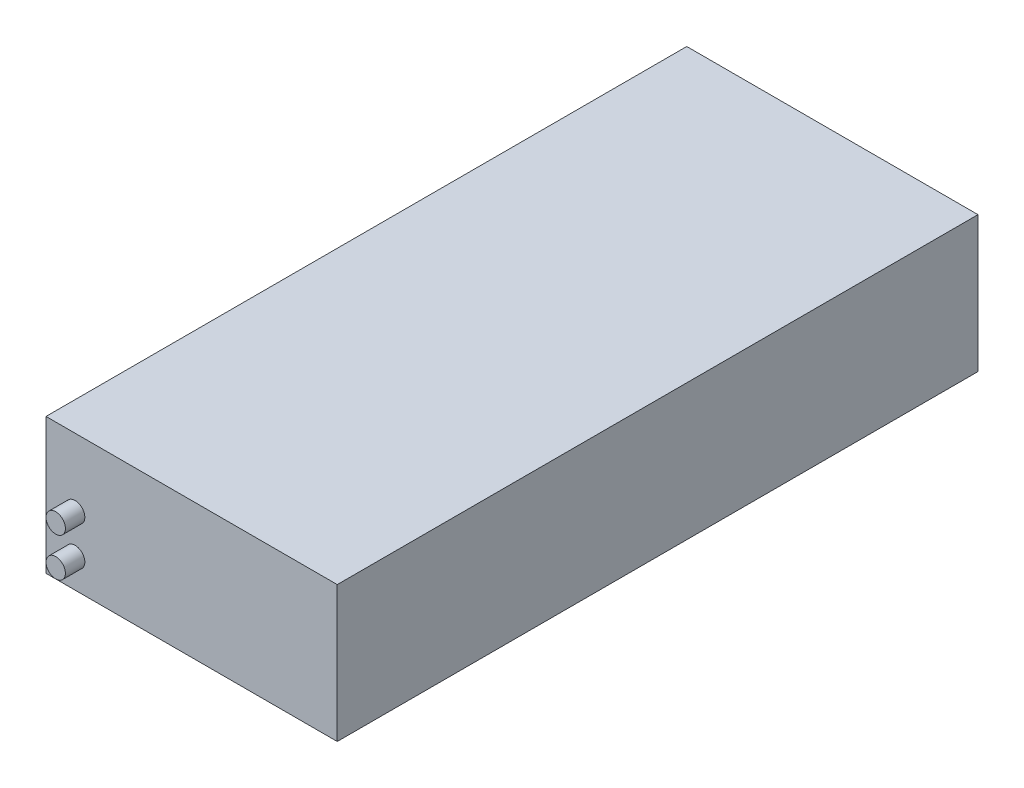
ISO-10303-21;
HEADER;
FILE_DESCRIPTION(('STEP AP214'),'2;1');
FILE_NAME('part.step','',(''),(''),'','','');
FILE_SCHEMA(('AUTOMOTIVE_DESIGN { 1 0 10303 214 1 1 1 1 }'));
ENDSEC;
DATA;
#1=APPLICATION_CONTEXT('core data for automotive mechanical design processes');
#2=APPLICATION_PROTOCOL_DEFINITION('international standard','automotive_design',2000,#1);
#3=PRODUCT_CONTEXT('',#1,'mechanical');
#4=PRODUCT('Part','Part','',(#3));
#5=PRODUCT_RELATED_PRODUCT_CATEGORY('part','',(#4));
#6=PRODUCT_DEFINITION_FORMATION('','',#4);
#7=PRODUCT_DEFINITION_CONTEXT('part definition',#1,'design');
#8=PRODUCT_DEFINITION('design','',#6,#7);
#9=PRODUCT_DEFINITION_SHAPE('','',#8);
#10=(LENGTH_UNIT() NAMED_UNIT(*) SI_UNIT(.MILLI.,.METRE.));
#11=(NAMED_UNIT(*) PLANE_ANGLE_UNIT() SI_UNIT($,.RADIAN.));
#12=(NAMED_UNIT(*) SI_UNIT($,.STERADIAN.) SOLID_ANGLE_UNIT());
#13=UNCERTAINTY_MEASURE_WITH_UNIT(LENGTH_MEASURE(1.E-05),#10,'distance_accuracy_value','');
#14=(GEOMETRIC_REPRESENTATION_CONTEXT(3) GLOBAL_UNCERTAINTY_ASSIGNED_CONTEXT((#13)) GLOBAL_UNIT_ASSIGNED_CONTEXT((#10,
#11,#12)) REPRESENTATION_CONTEXT('',''));
#15=CARTESIAN_POINT('',(0.,0.,0.));
#16=DIRECTION('',(0.,0.,1.));
#17=DIRECTION('',(1.,0.,0.));
#18=AXIS2_PLACEMENT_3D('',#15,#16,#17);
#19=CARTESIAN_POINT('',(75.,35.,330.));
#20=DIRECTION('',(-1.,0.,0.));
#21=DIRECTION('',(0.,0.,1.));
#22=AXIS2_PLACEMENT_3D('',#19,#20,#21);
#23=PLANE('',#22);
#24=DIRECTION('',(0.,1.,0.));
#25=VECTOR('',#24,1.);
#26=CARTESIAN_POINT('',(75.,35.,0.));
#27=LINE('',#26,#25);
#28=CARTESIAN_POINT('',(75.,-35.,0.));
#29=VERTEX_POINT('',#28);
#30=CARTESIAN_POINT('',(75.,35.,0.));
#31=VERTEX_POINT('',#30);
#32=EDGE_CURVE('E96',#29,#31,#27,.T.);
#33=ORIENTED_EDGE('',*,*,#32,.T.);
#34=DIRECTION('',(0.,0.,-1.));
#35=VECTOR('',#34,1.);
#36=CARTESIAN_POINT('',(75.,35.,330.));
#37=LINE('',#36,#35);
#38=CARTESIAN_POINT('',(75.,35.,330.));
#39=VERTEX_POINT('',#38);
#40=EDGE_CURVE('E11',#39,#31,#37,.T.);
#41=ORIENTED_EDGE('',*,*,#40,.F.);
#42=DIRECTION('',(0.,1.,0.));
#43=VECTOR('',#42,1.);
#44=CARTESIAN_POINT('',(75.,35.,330.));
#45=LINE('',#44,#43);
#46=CARTESIAN_POINT('',(75.,-35.,330.));
#47=VERTEX_POINT('',#46);
#48=EDGE_CURVE('E84',#47,#39,#45,.T.);
#49=ORIENTED_EDGE('',*,*,#48,.F.);
#50=DIRECTION('',(0.,0.,-1.));
#51=VECTOR('',#50,1.);
#52=CARTESIAN_POINT('',(75.,-35.,330.));
#53=LINE('',#52,#51);
#54=EDGE_CURVE('E92',#47,#29,#53,.T.);
#55=ORIENTED_EDGE('',*,*,#54,.T.);
#56=EDGE_LOOP('',(#33,#41,#49,#55));
#57=FACE_BOUND('',#56,.T.);
#58=ADVANCED_FACE('F33',(#57),#23,.F.);
#59=CARTESIAN_POINT('',(-75.,35.,330.));
#60=DIRECTION('',(0.,-1.,0.));
#61=DIRECTION('',(0.,0.,-1.));
#62=AXIS2_PLACEMENT_3D('',#59,#60,#61);
#63=PLANE('',#62);
#64=DIRECTION('',(-1.,0.,0.));
#65=VECTOR('',#64,1.);
#66=CARTESIAN_POINT('',(-75.,35.,0.));
#67=LINE('',#66,#65);
#68=CARTESIAN_POINT('',(-75.,35.,0.));
#69=VERTEX_POINT('',#68);
#70=EDGE_CURVE('E88',#31,#69,#67,.T.);
#71=ORIENTED_EDGE('',*,*,#70,.T.);
#72=DIRECTION('',(0.,0.,-1.));
#73=VECTOR('',#72,1.);
#74=CARTESIAN_POINT('',(-75.,35.,330.));
#75=LINE('',#74,#73);
#76=CARTESIAN_POINT('',(-75.,35.,330.));
#77=VERTEX_POINT('',#76);
#78=EDGE_CURVE('E41',#77,#69,#75,.T.);
#79=ORIENTED_EDGE('',*,*,#78,.F.);
#80=DIRECTION('',(-1.,0.,0.));
#81=VECTOR('',#80,1.);
#82=CARTESIAN_POINT('',(-75.,35.,330.));
#83=LINE('',#82,#81);
#84=EDGE_CURVE('E79',#39,#77,#83,.T.);
#85=ORIENTED_EDGE('',*,*,#84,.F.);
#86=ORIENTED_EDGE('',*,*,#40,.T.);
#87=EDGE_LOOP('',(#71,#79,#85,#86));
#88=FACE_BOUND('',#87,.T.);
#89=ADVANCED_FACE('F87',(#88),#63,.F.);
#90=CARTESIAN_POINT('',(-75.,35.,330.));
#91=DIRECTION('',(1.,0.,0.));
#92=DIRECTION('',(0.,0.,-1.));
#93=AXIS2_PLACEMENT_3D('',#90,#91,#92);
#94=PLANE('',#93);
#95=DIRECTION('',(0.,-1.,0.));
#96=VECTOR('',#95,1.);
#97=CARTESIAN_POINT('',(-75.,35.,0.));
#98=LINE('',#97,#96);
#99=CARTESIAN_POINT('',(-75.,-35.,0.));
#100=VERTEX_POINT('',#99);
#101=EDGE_CURVE('E66',#69,#100,#98,.T.);
#102=ORIENTED_EDGE('',*,*,#101,.T.);
#103=DIRECTION('',(0.,0.,-1.));
#104=VECTOR('',#103,1.);
#105=CARTESIAN_POINT('',(-75.,-35.,330.));
#106=LINE('',#105,#104);
#107=CARTESIAN_POINT('',(-75.,-35.,330.));
#108=VERTEX_POINT('',#107);
#109=EDGE_CURVE('E89',#108,#100,#106,.T.);
#110=ORIENTED_EDGE('',*,*,#109,.F.);
#111=DIRECTION('',(0.,-1.,0.));
#112=VECTOR('',#111,1.);
#113=CARTESIAN_POINT('',(-75.,35.,330.));
#114=LINE('',#113,#112);
#115=EDGE_CURVE('E82',#77,#108,#114,.T.);
#116=ORIENTED_EDGE('',*,*,#115,.F.);
#117=ORIENTED_EDGE('',*,*,#78,.T.);
#118=EDGE_LOOP('',(#102,#110,#116,#117));
#119=FACE_BOUND('',#118,.T.);
#120=ADVANCED_FACE('F90',(#119),#94,.F.);
#121=CARTESIAN_POINT('',(-75.,-35.,330.));
#122=DIRECTION('',(0.,1.,0.));
#123=DIRECTION('',(0.,0.,1.));
#124=AXIS2_PLACEMENT_3D('',#121,#122,#123);
#125=PLANE('',#124);
#126=DIRECTION('',(1.,0.,0.));
#127=VECTOR('',#126,1.);
#128=CARTESIAN_POINT('',(-75.,-35.,0.));
#129=LINE('',#128,#127);
#130=EDGE_CURVE('E72',#100,#29,#129,.T.);
#131=ORIENTED_EDGE('',*,*,#130,.T.);
#132=ORIENTED_EDGE('',*,*,#54,.F.);
#133=DIRECTION('',(1.,0.,0.));
#134=VECTOR('',#133,1.);
#135=CARTESIAN_POINT('',(-75.,-35.,330.));
#136=LINE('',#135,#134);
#137=EDGE_CURVE('E49',#108,#47,#136,.T.);
#138=ORIENTED_EDGE('',*,*,#137,.F.);
#139=ORIENTED_EDGE('',*,*,#109,.T.);
#140=EDGE_LOOP('',(#131,#132,#138,#139));
#141=FACE_BOUND('',#140,.T.);
#142=ADVANCED_FACE('F104',(#141),#125,.F.);
#143=CARTESIAN_POINT('',(0.,0.,330.));
#144=DIRECTION('',(0.,0.,1.));
#145=DIRECTION('',(1.,0.,0.));
#146=AXIS2_PLACEMENT_3D('',#143,#144,#145);
#147=PLANE('',#146);
#148=CARTESIAN_POINT('',(-60.,-20.,330.));
#149=DIRECTION('',(0.,0.,1.));
#150=DIRECTION('',(1.,0.,0.));
#151=AXIS2_PLACEMENT_3D('',#148,#149,#150);
#152=CIRCLE('',#151,5.);
#153=CARTESIAN_POINT('',(-55.,-20.,330.));
#154=VERTEX_POINT('',#153);
#155=EDGE_CURVE('E116',#154,#154,#152,.T.);
#156=ORIENTED_EDGE('',*,*,#155,.F.);
#157=EDGE_LOOP('',(#156));
#158=FACE_BOUND('',#157,.T.);
#159=CARTESIAN_POINT('',(-60.,0.,330.));
#160=DIRECTION('',(0.,0.,1.));
#161=DIRECTION('',(1.,0.,0.));
#162=AXIS2_PLACEMENT_3D('',#159,#160,#161);
#163=CIRCLE('',#162,5.);
#164=CARTESIAN_POINT('',(-55.,0.,330.));
#165=VERTEX_POINT('',#164);
#166=EDGE_CURVE('E110',#165,#165,#163,.T.);
#167=ORIENTED_EDGE('',*,*,#166,.F.);
#168=EDGE_LOOP('',(#167));
#169=FACE_BOUND('',#168,.T.);
#170=ORIENTED_EDGE('',*,*,#48,.T.);
#171=ORIENTED_EDGE('',*,*,#84,.T.);
#172=ORIENTED_EDGE('',*,*,#115,.T.);
#173=ORIENTED_EDGE('',*,*,#137,.T.);
#174=EDGE_LOOP('',(#170,#171,#172,#173));
#175=FACE_BOUND('',#174,.T.);
#176=ADVANCED_FACE('F80',(#158,#169,#175),#147,.T.);
#177=CARTESIAN_POINT('',(0.,0.,0.));
#178=DIRECTION('',(0.,0.,1.));
#179=DIRECTION('',(1.,0.,0.));
#180=AXIS2_PLACEMENT_3D('',#177,#178,#179);
#181=PLANE('',#180);
#182=ORIENTED_EDGE('',*,*,#32,.F.);
#183=ORIENTED_EDGE('',*,*,#130,.F.);
#184=ORIENTED_EDGE('',*,*,#101,.F.);
#185=ORIENTED_EDGE('',*,*,#70,.F.);
#186=EDGE_LOOP('',(#182,#183,#184,#185));
#187=FACE_BOUND('',#186,.T.);
#188=ADVANCED_FACE('F107',(#187),#181,.F.);
#189=CARTESIAN_POINT('',(-60.,0.,340.));
#190=DIRECTION('',(0.,0.,-1.));
#191=DIRECTION('',(-1.,0.,0.));
#192=AXIS2_PLACEMENT_3D('',#189,#190,#191);
#193=CYLINDRICAL_SURFACE('',#192,5.);
#194=CARTESIAN_POINT('',(-60.,0.,340.));
#195=DIRECTION('',(0.,0.,1.));
#196=DIRECTION('',(1.,0.,0.));
#197=AXIS2_PLACEMENT_3D('',#194,#195,#196);
#198=CIRCLE('',#197,5.);
#199=CARTESIAN_POINT('',(-55.,0.,340.));
#200=VERTEX_POINT('',#199);
#201=EDGE_CURVE('E99',#200,#200,#198,.T.);
#202=ORIENTED_EDGE('',*,*,#201,.F.);
#203=EDGE_LOOP('',(#202));
#204=FACE_BOUND('',#203,.T.);
#205=ORIENTED_EDGE('',*,*,#166,.T.);
#206=EDGE_LOOP('',(#205));
#207=FACE_BOUND('',#206,.T.);
#208=ADVANCED_FACE('F136',(#204,#207),#193,.T.);
#209=CARTESIAN_POINT('',(-60.,0.,340.));
#210=DIRECTION('',(0.,0.,1.));
#211=DIRECTION('',(1.,0.,0.));
#212=AXIS2_PLACEMENT_3D('',#209,#210,#211);
#213=PLANE('',#212);
#214=ORIENTED_EDGE('',*,*,#201,.T.);
#215=EDGE_LOOP('',(#214));
#216=FACE_BOUND('',#215,.T.);
#217=ADVANCED_FACE('F127',(#216),#213,.T.);
#218=CARTESIAN_POINT('',(-60.,-20.,340.));
#219=DIRECTION('',(0.,0.,-1.));
#220=DIRECTION('',(-1.,0.,0.));
#221=AXIS2_PLACEMENT_3D('',#218,#219,#220);
#222=CYLINDRICAL_SURFACE('',#221,5.);
#223=CARTESIAN_POINT('',(-60.,-20.,340.));
#224=DIRECTION('',(0.,0.,1.));
#225=DIRECTION('',(1.,0.,0.));
#226=AXIS2_PLACEMENT_3D('',#223,#224,#225);
#227=CIRCLE('',#226,5.);
#228=CARTESIAN_POINT('',(-55.,-20.,340.));
#229=VERTEX_POINT('',#228);
#230=EDGE_CURVE('E113',#229,#229,#227,.T.);
#231=ORIENTED_EDGE('',*,*,#230,.F.);
#232=EDGE_LOOP('',(#231));
#233=FACE_BOUND('',#232,.T.);
#234=ORIENTED_EDGE('',*,*,#155,.T.);
#235=EDGE_LOOP('',(#234));
#236=FACE_BOUND('',#235,.T.);
#237=ADVANCED_FACE('F124',(#233,#236),#222,.T.);
#238=CARTESIAN_POINT('',(-60.,-20.,340.));
#239=DIRECTION('',(0.,0.,1.));
#240=DIRECTION('',(1.,0.,0.));
#241=AXIS2_PLACEMENT_3D('',#238,#239,#240);
#242=PLANE('',#241);
#243=ORIENTED_EDGE('',*,*,#230,.T.);
#244=EDGE_LOOP('',(#243));
#245=FACE_BOUND('',#244,.T.);
#246=ADVANCED_FACE('F122',(#245),#242,.T.);
#247=CLOSED_SHELL('',(#58,#89,#120,#142,#176,#188,#208,#217,#237,#246));
#248=MANIFOLD_SOLID_BREP('B2',#247);
#249=ADVANCED_BREP_SHAPE_REPRESENTATION('',(#18,#248),#14);
#250=SHAPE_DEFINITION_REPRESENTATION(#9,#249);
ENDSEC;
END-ISO-10303-21;
